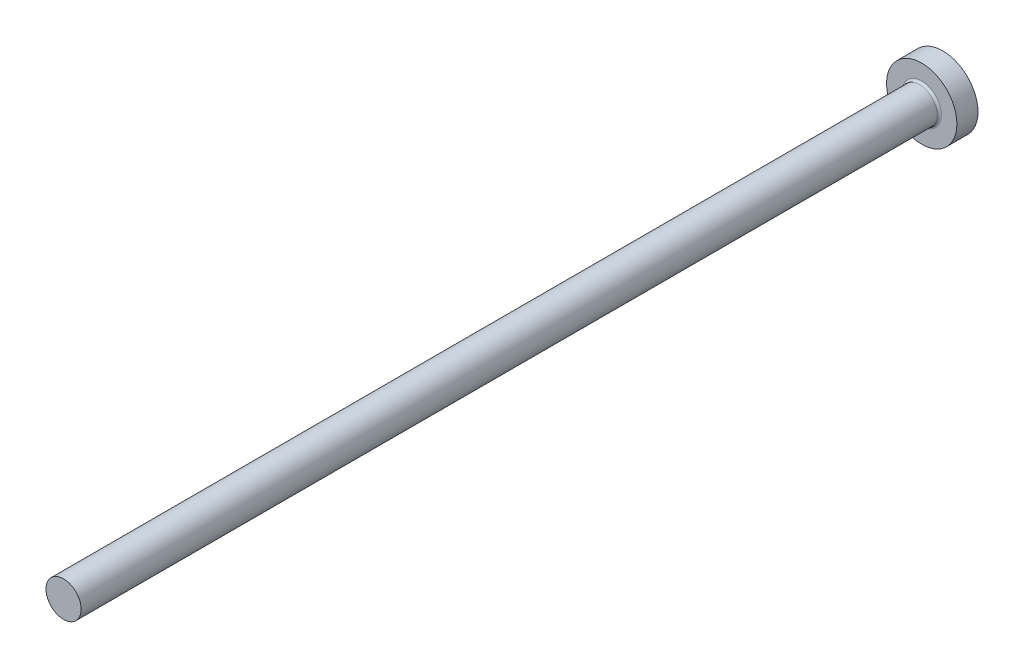
ISO-10303-21;
HEADER;
FILE_DESCRIPTION(('STEP AP214'),'2;1');
FILE_NAME('part.step','',(''),(''),'','','');
FILE_SCHEMA(('AUTOMOTIVE_DESIGN { 1 0 10303 214 1 1 1 1 }'));
ENDSEC;
DATA;
#1=APPLICATION_CONTEXT('core data for automotive mechanical design processes');
#2=APPLICATION_PROTOCOL_DEFINITION('international standard','automotive_design',2000,#1);
#3=PRODUCT_CONTEXT('',#1,'mechanical');
#4=PRODUCT('Part','Part','',(#3));
#5=PRODUCT_RELATED_PRODUCT_CATEGORY('part','',(#4));
#6=PRODUCT_DEFINITION_FORMATION('','',#4);
#7=PRODUCT_DEFINITION_CONTEXT('part definition',#1,'design');
#8=PRODUCT_DEFINITION('design','',#6,#7);
#9=PRODUCT_DEFINITION_SHAPE('','',#8);
#10=(LENGTH_UNIT() NAMED_UNIT(*) SI_UNIT(.MILLI.,.METRE.));
#11=(NAMED_UNIT(*) PLANE_ANGLE_UNIT() SI_UNIT($,.RADIAN.));
#12=(NAMED_UNIT(*) SI_UNIT($,.STERADIAN.) SOLID_ANGLE_UNIT());
#13=UNCERTAINTY_MEASURE_WITH_UNIT(LENGTH_MEASURE(1.E-05),#10,'distance_accuracy_value','');
#14=(GEOMETRIC_REPRESENTATION_CONTEXT(3) GLOBAL_UNCERTAINTY_ASSIGNED_CONTEXT((#13)) GLOBAL_UNIT_ASSIGNED_CONTEXT((#10,
#11,#12)) REPRESENTATION_CONTEXT('',''));
#15=CARTESIAN_POINT('',(0.,0.,0.));
#16=DIRECTION('',(0.,0.,1.));
#17=DIRECTION('',(1.,0.,0.));
#18=AXIS2_PLACEMENT_3D('',#15,#16,#17);
#19=CARTESIAN_POINT('',(0.,0.,3.));
#20=DIRECTION('',(0.,0.,-1.));
#21=DIRECTION('',(-1.,0.,0.));
#22=AXIS2_PLACEMENT_3D('',#19,#20,#21);
#23=PLANE('',#22);
#24=CARTESIAN_POINT('',(0.,0.,3.));
#25=DIRECTION('',(0.,0.,1.));
#26=DIRECTION('',(1.,0.,0.));
#27=AXIS2_PLACEMENT_3D('',#24,#25,#26);
#28=CIRCLE('',#27,5.);
#29=CARTESIAN_POINT('',(5.,0.,3.));
#30=VERTEX_POINT('',#29);
#31=EDGE_CURVE('E43',#30,#30,#28,.T.);
#32=ORIENTED_EDGE('',*,*,#31,.T.);
#33=EDGE_LOOP('',(#32));
#34=FACE_BOUND('',#33,.T.);
#35=CARTESIAN_POINT('',(0.,0.,3.));
#36=DIRECTION('',(0.,0.,1.));
#37=DIRECTION('',(1.,0.,0.));
#38=AXIS2_PLACEMENT_3D('',#35,#36,#37);
#39=CIRCLE('',#38,2.79999999999999);
#40=CARTESIAN_POINT('',(2.79999999999999,0.,3.));
#41=VERTEX_POINT('',#40);
#42=EDGE_CURVE('E10',#41,#41,#39,.T.);
#43=ORIENTED_EDGE('',*,*,#42,.F.);
#44=EDGE_LOOP('',(#43));
#45=FACE_BOUND('',#44,.T.);
#46=ADVANCED_FACE('F33',(#34,#45),#23,.F.);
#47=CARTESIAN_POINT('',(0.,0.,0.));
#48=DIRECTION('',(0.,0.,1.));
#49=DIRECTION('',(1.,0.,0.));
#50=AXIS2_PLACEMENT_3D('',#47,#48,#49);
#51=CYLINDRICAL_SURFACE('',#50,5.);
#52=ORIENTED_EDGE('',*,*,#31,.F.);
#53=EDGE_LOOP('',(#52));
#54=FACE_BOUND('',#53,.T.);
#55=CARTESIAN_POINT('',(0.,0.,0.));
#56=DIRECTION('',(0.,0.,1.));
#57=DIRECTION('',(1.,0.,0.));
#58=AXIS2_PLACEMENT_3D('',#55,#56,#57);
#59=CIRCLE('',#58,5.);
#60=CARTESIAN_POINT('',(5.,0.,0.));
#61=VERTEX_POINT('',#60);
#62=EDGE_CURVE('E47',#61,#61,#59,.T.);
#63=ORIENTED_EDGE('',*,*,#62,.T.);
#64=EDGE_LOOP('',(#63));
#65=FACE_BOUND('',#64,.T.);
#66=ADVANCED_FACE('F69',(#54,#65),#51,.T.);
#67=CARTESIAN_POINT('',(0.,5.,0.));
#68=DIRECTION('',(0.,0.,1.));
#69=DIRECTION('',(1.,0.,0.));
#70=AXIS2_PLACEMENT_3D('',#67,#68,#69);
#71=PLANE('',#70);
#72=ORIENTED_EDGE('',*,*,#62,.F.);
#73=EDGE_LOOP('',(#72));
#74=FACE_BOUND('',#73,.T.);
#75=ADVANCED_FACE('F74',(#74),#71,.F.);
#76=CARTESIAN_POINT('',(0.,0.,3.29999999999999));
#77=DIRECTION('',(0.,0.,1.));
#78=DIRECTION('',(1.,0.,0.));
#79=AXIS2_PLACEMENT_3D('',#76,#77,#78);
#80=TOROIDAL_SURFACE('',#79,2.79999999999999,0.299999999999994);
#81=CARTESIAN_POINT('',(0.,0.,3.29999999999999));
#82=DIRECTION('',(0.,0.,1.));
#83=DIRECTION('',(1.,0.,0.));
#84=AXIS2_PLACEMENT_3D('',#81,#82,#83);
#85=CIRCLE('',#84,2.5);
#86=CARTESIAN_POINT('',(2.5,0.,3.29999999999999));
#87=VERTEX_POINT('',#86);
#88=EDGE_CURVE('E39',#87,#87,#85,.F.);
#89=ORIENTED_EDGE('',*,*,#88,.T.);
#90=EDGE_LOOP('',(#89));
#91=FACE_BOUND('',#90,.T.);
#92=ORIENTED_EDGE('',*,*,#42,.T.);
#93=EDGE_LOOP('',(#92));
#94=FACE_BOUND('',#93,.T.);
#95=ADVANCED_FACE('F65',(#91,#94),#80,.F.);
#96=CARTESIAN_POINT('',(0.,0.,125.));
#97=DIRECTION('',(0.,0.,-1.));
#98=DIRECTION('',(-1.,0.,0.));
#99=AXIS2_PLACEMENT_3D('',#96,#97,#98);
#100=PLANE('',#99);
#101=CARTESIAN_POINT('',(0.,0.,125.));
#102=DIRECTION('',(0.,0.,1.));
#103=DIRECTION('',(1.,0.,0.));
#104=AXIS2_PLACEMENT_3D('',#101,#102,#103);
#105=CIRCLE('',#104,2.5);
#106=CARTESIAN_POINT('',(2.5,0.,125.));
#107=VERTEX_POINT('',#106);
#108=EDGE_CURVE('E52',#107,#107,#105,.T.);
#109=ORIENTED_EDGE('',*,*,#108,.T.);
#110=EDGE_LOOP('',(#109));
#111=FACE_BOUND('',#110,.T.);
#112=ADVANCED_FACE('F56',(#111),#100,.F.);
#113=CARTESIAN_POINT('',(0.,0.,3.));
#114=DIRECTION('',(0.,0.,1.));
#115=DIRECTION('',(1.,0.,0.));
#116=AXIS2_PLACEMENT_3D('',#113,#114,#115);
#117=CYLINDRICAL_SURFACE('',#116,2.5);
#118=ORIENTED_EDGE('',*,*,#108,.F.);
#119=EDGE_LOOP('',(#118));
#120=FACE_BOUND('',#119,.T.);
#121=ORIENTED_EDGE('',*,*,#88,.F.);
#122=EDGE_LOOP('',(#121));
#123=FACE_BOUND('',#122,.T.);
#124=ADVANCED_FACE('F58',(#120,#123),#117,.T.);
#125=CLOSED_SHELL('',(#46,#66,#75,#95,#112,#124));
#126=MANIFOLD_SOLID_BREP('B2',#125);
#127=ADVANCED_BREP_SHAPE_REPRESENTATION('',(#18,#126),#14);
#128=SHAPE_DEFINITION_REPRESENTATION(#9,#127);
ENDSEC;
END-ISO-10303-21;
